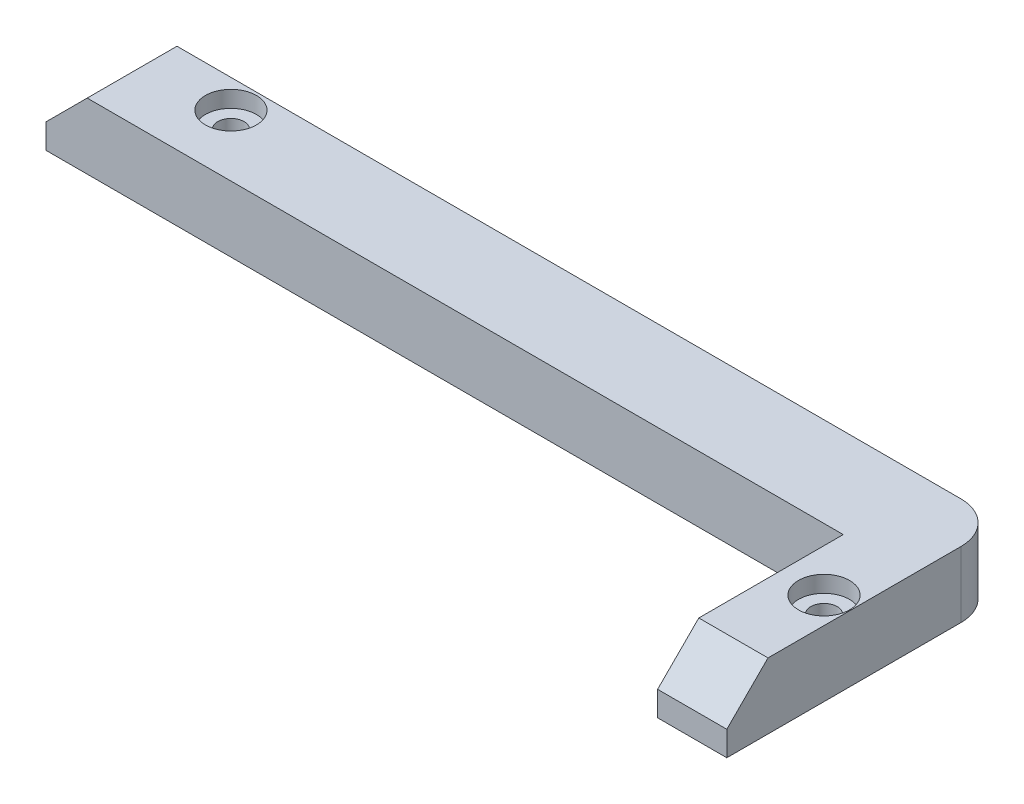
ISO-10303-21;
HEADER;
FILE_DESCRIPTION(('STEP AP214'),'2;1');
FILE_NAME('part.step','',(''),(''),'','','');
FILE_SCHEMA(('AUTOMOTIVE_DESIGN { 1 0 10303 214 1 1 1 1 }'));
ENDSEC;
DATA;
#1=APPLICATION_CONTEXT('core data for automotive mechanical design processes');
#2=APPLICATION_PROTOCOL_DEFINITION('international standard','automotive_design',2000,#1);
#3=PRODUCT_CONTEXT('',#1,'mechanical');
#4=PRODUCT('Part','Part','',(#3));
#5=PRODUCT_RELATED_PRODUCT_CATEGORY('part','',(#4));
#6=PRODUCT_DEFINITION_FORMATION('','',#4);
#7=PRODUCT_DEFINITION_CONTEXT('part definition',#1,'design');
#8=PRODUCT_DEFINITION('design','',#6,#7);
#9=PRODUCT_DEFINITION_SHAPE('','',#8);
#10=(LENGTH_UNIT() NAMED_UNIT(*) SI_UNIT(.MILLI.,.METRE.));
#11=(NAMED_UNIT(*) PLANE_ANGLE_UNIT() SI_UNIT($,.RADIAN.));
#12=(NAMED_UNIT(*) SI_UNIT($,.STERADIAN.) SOLID_ANGLE_UNIT());
#13=UNCERTAINTY_MEASURE_WITH_UNIT(LENGTH_MEASURE(1.E-05),#10,'distance_accuracy_value','');
#14=(GEOMETRIC_REPRESENTATION_CONTEXT(3) GLOBAL_UNCERTAINTY_ASSIGNED_CONTEXT((#13)) GLOBAL_UNIT_ASSIGNED_CONTEXT((#10,
#11,#12)) REPRESENTATION_CONTEXT('',''));
#15=CARTESIAN_POINT('',(0.,0.,0.));
#16=DIRECTION('',(0.,0.,1.));
#17=DIRECTION('',(1.,0.,0.));
#18=AXIS2_PLACEMENT_3D('',#15,#16,#17);
#19=CARTESIAN_POINT('',(328.95,0.,0.));
#20=DIRECTION('',(1.,0.,0.));
#21=DIRECTION('',(0.,0.,-1.));
#22=AXIS2_PLACEMENT_3D('',#19,#20,#21);
#23=PLANE('',#22);
#24=DIRECTION('',(0.,-1.,0.));
#25=VECTOR('',#24,1.);
#26=CARTESIAN_POINT('',(328.95,8.,-105.97));
#27=LINE('',#26,#25);
#28=CARTESIAN_POINT('',(328.95,8.,-105.97));
#29=VERTEX_POINT('',#28);
#30=CARTESIAN_POINT('',(328.95,0.,-105.97));
#31=VERTEX_POINT('',#30);
#32=EDGE_CURVE('E123',#29,#31,#27,.T.);
#33=ORIENTED_EDGE('',*,*,#32,.T.);
#34=DIRECTION('',(0.,0.,1.));
#35=VECTOR('',#34,1.);
#36=CARTESIAN_POINT('',(328.95,0.,0.));
#37=LINE('',#36,#35);
#38=CARTESIAN_POINT('',(328.95,0.,-83.435));
#39=VERTEX_POINT('',#38);
#40=EDGE_CURVE('E134',#31,#39,#37,.T.);
#41=ORIENTED_EDGE('',*,*,#40,.T.);
#42=DIRECTION('',(0.,-1.,0.));
#43=VECTOR('',#42,1.);
#44=CARTESIAN_POINT('',(328.95,0.,-83.435));
#45=LINE('',#44,#43);
#46=CARTESIAN_POINT('',(328.95,2.99999999999998,-83.435));
#47=VERTEX_POINT('',#46);
#48=EDGE_CURVE('E130',#47,#39,#45,.T.);
#49=ORIENTED_EDGE('',*,*,#48,.F.);
#50=DIRECTION('',(0.,0.707106781186549,-0.707106781186547));
#51=VECTOR('',#50,1.);
#52=CARTESIAN_POINT('',(328.95,8.,-88.435));
#53=LINE('',#52,#51);
#54=CARTESIAN_POINT('',(328.95,8.,-88.435));
#55=VERTEX_POINT('',#54);
#56=EDGE_CURVE('E199',#47,#55,#53,.T.);
#57=ORIENTED_EDGE('',*,*,#56,.T.);
#58=DIRECTION('',(0.,0.,-1.));
#59=VECTOR('',#58,1.);
#60=CARTESIAN_POINT('',(328.95,8.,-6.9));
#61=LINE('',#60,#59);
#62=EDGE_CURVE('E137',#55,#29,#61,.T.);
#63=ORIENTED_EDGE('',*,*,#62,.T.);
#64=EDGE_LOOP('',(#33,#41,#49,#57,#63));
#65=FACE_BOUND('',#64,.T.);
#66=ADVANCED_FACE('F49',(#65),#23,.F.);
#67=CARTESIAN_POINT('',(0.,0.,-105.97));
#68=DIRECTION('',(0.,0.,-1.));
#69=DIRECTION('',(-1.,0.,0.));
#70=AXIS2_PLACEMENT_3D('',#67,#68,#69);
#71=PLANE('',#70);
#72=DIRECTION('',(1.,0.,0.));
#73=VECTOR('',#72,1.);
#74=CARTESIAN_POINT('',(0.,0.,-105.97));
#75=LINE('',#74,#73);
#76=CARTESIAN_POINT('',(232.17,0.,-105.97));
#77=VERTEX_POINT('',#76);
#78=EDGE_CURVE('E120',#77,#31,#75,.T.);
#79=ORIENTED_EDGE('',*,*,#78,.T.);
#80=ORIENTED_EDGE('',*,*,#32,.F.);
#81=DIRECTION('',(-1.,0.,0.));
#82=VECTOR('',#81,1.);
#83=CARTESIAN_POINT('',(73.9,8.,-105.97));
#84=LINE('',#83,#82);
#85=CARTESIAN_POINT('',(237.17,8.,-105.97));
#86=VERTEX_POINT('',#85);
#87=EDGE_CURVE('E138',#29,#86,#84,.T.);
#88=ORIENTED_EDGE('',*,*,#87,.T.);
#89=DIRECTION('',(-0.707106781186544,-0.707106781186551,0.));
#90=VECTOR('',#89,1.);
#91=CARTESIAN_POINT('',(237.17,8.,-105.97));
#92=LINE('',#91,#90);
#93=CARTESIAN_POINT('',(232.17,3.,-105.97));
#94=VERTEX_POINT('',#93);
#95=EDGE_CURVE('E72',#86,#94,#92,.T.);
#96=ORIENTED_EDGE('',*,*,#95,.T.);
#97=DIRECTION('',(0.,1.,0.));
#98=VECTOR('',#97,1.);
#99=CARTESIAN_POINT('',(232.17,0.,-105.97));
#100=LINE('',#99,#98);
#101=EDGE_CURVE('E125',#77,#94,#100,.T.);
#102=ORIENTED_EDGE('',*,*,#101,.F.);
#103=EDGE_LOOP('',(#79,#80,#88,#96,#102));
#104=FACE_BOUND('',#103,.T.);
#105=ADVANCED_FACE('F122',(#104),#71,.F.);
#106=CARTESIAN_POINT('',(0.,8.,0.));
#107=DIRECTION('',(0.,-1.,0.));
#108=DIRECTION('',(0.,0.,-1.));
#109=AXIS2_PLACEMENT_3D('',#106,#107,#108);
#110=PLANE('',#109);
#111=CARTESIAN_POINT('',(247.17,8.,-113.42));
#112=DIRECTION('',(0.,1.,0.));
#113=DIRECTION('',(0.,0.,1.));
#114=AXIS2_PLACEMENT_3D('',#111,#112,#113);
#115=CIRCLE('',#114,3.09999999999999);
#116=CARTESIAN_POINT('',(247.17,8.,-110.32));
#117=VERTEX_POINT('',#116);
#118=EDGE_CURVE('E222',#117,#117,#115,.T.);
#119=ORIENTED_EDGE('',*,*,#118,.F.);
#120=EDGE_LOOP('',(#119));
#121=FACE_BOUND('',#120,.T.);
#122=CARTESIAN_POINT('',(334.15,8.,-98.435));
#123=DIRECTION('',(0.,1.,0.));
#124=DIRECTION('',(0.,0.,1.));
#125=AXIS2_PLACEMENT_3D('',#122,#123,#124);
#126=CIRCLE('',#125,3.09999999999999);
#127=CARTESIAN_POINT('',(334.15,8.,-95.335));
#128=VERTEX_POINT('',#127);
#129=EDGE_CURVE('E129',#128,#128,#126,.T.);
#130=ORIENTED_EDGE('',*,*,#129,.F.);
#131=EDGE_LOOP('',(#130));
#132=FACE_BOUND('',#131,.T.);
#133=ORIENTED_EDGE('',*,*,#62,.F.);
#134=DIRECTION('',(1.,0.,0.));
#135=VECTOR('',#134,1.);
#136=CARTESIAN_POINT('',(337.35,8.,-88.435));
#137=LINE('',#136,#135);
#138=CARTESIAN_POINT('',(337.35,8.,-88.435));
#139=VERTEX_POINT('',#138);
#140=EDGE_CURVE('E192',#55,#139,#137,.T.);
#141=ORIENTED_EDGE('',*,*,#140,.T.);
#142=DIRECTION('',(0.,0.,-1.));
#143=VECTOR('',#142,1.);
#144=CARTESIAN_POINT('',(337.35,8.,0.));
#145=LINE('',#144,#143);
#146=CARTESIAN_POINT('',(337.35,8.,-111.87));
#147=VERTEX_POINT('',#146);
#148=EDGE_CURVE('E162',#139,#147,#145,.T.);
#149=ORIENTED_EDGE('',*,*,#148,.T.);
#150=CARTESIAN_POINT('',(332.35,8.,-111.87));
#151=DIRECTION('',(0.,-1.,0.));
#152=DIRECTION('',(0.,0.,-1.));
#153=AXIS2_PLACEMENT_3D('',#150,#151,#152);
#154=CIRCLE('',#153,5.);
#155=CARTESIAN_POINT('',(332.35,8.,-116.87));
#156=VERTEX_POINT('',#155);
#157=EDGE_CURVE('E173',#147,#156,#154,.F.);
#158=ORIENTED_EDGE('',*,*,#157,.T.);
#159=DIRECTION('',(-1.,0.,0.));
#160=VECTOR('',#159,1.);
#161=CARTESIAN_POINT('',(0.,8.,-116.87));
#162=LINE('',#161,#160);
#163=CARTESIAN_POINT('',(237.17,8.,-116.87));
#164=VERTEX_POINT('',#163);
#165=EDGE_CURVE('E164',#156,#164,#162,.T.);
#166=ORIENTED_EDGE('',*,*,#165,.T.);
#167=DIRECTION('',(0.,0.,1.));
#168=VECTOR('',#167,1.);
#169=CARTESIAN_POINT('',(237.17,8.,-105.97));
#170=LINE('',#169,#168);
#171=EDGE_CURVE('E189',#164,#86,#170,.T.);
#172=ORIENTED_EDGE('',*,*,#171,.T.);
#173=ORIENTED_EDGE('',*,*,#87,.F.);
#174=EDGE_LOOP('',(#133,#141,#149,#158,#166,#172,#173));
#175=FACE_BOUND('',#174,.T.);
#176=ADVANCED_FACE('F206',(#121,#132,#175),#110,.F.);
#177=CARTESIAN_POINT('',(0.,0.,0.));
#178=DIRECTION('',(0.,-1.,0.));
#179=DIRECTION('',(0.,0.,-1.));
#180=AXIS2_PLACEMENT_3D('',#177,#178,#179);
#181=PLANE('',#180);
#182=CARTESIAN_POINT('',(247.17,0.,-113.42));
#183=DIRECTION('',(0.,1.,0.));
#184=DIRECTION('',(0.,0.,1.));
#185=AXIS2_PLACEMENT_3D('',#182,#183,#184);
#186=CIRCLE('',#185,1.59999999999999);
#187=CARTESIAN_POINT('',(247.17,0.,-111.82));
#188=VERTEX_POINT('',#187);
#189=EDGE_CURVE('E155',#188,#188,#186,.T.);
#190=ORIENTED_EDGE('',*,*,#189,.T.);
#191=EDGE_LOOP('',(#190));
#192=FACE_BOUND('',#191,.T.);
#193=ORIENTED_EDGE('',*,*,#78,.F.);
#194=DIRECTION('',(0.,0.,1.));
#195=VECTOR('',#194,1.);
#196=CARTESIAN_POINT('',(232.17,0.,-117.98568135859));
#197=LINE('',#196,#195);
#198=CARTESIAN_POINT('',(232.17,0.,-116.87));
#199=VERTEX_POINT('',#198);
#200=EDGE_CURVE('E214',#199,#77,#197,.T.);
#201=ORIENTED_EDGE('',*,*,#200,.F.);
#202=DIRECTION('',(-1.,0.,0.));
#203=VECTOR('',#202,1.);
#204=CARTESIAN_POINT('',(0.,0.,-116.87));
#205=LINE('',#204,#203);
#206=CARTESIAN_POINT('',(332.35,0.,-116.87));
#207=VERTEX_POINT('',#206);
#208=EDGE_CURVE('E165',#207,#199,#205,.T.);
#209=ORIENTED_EDGE('',*,*,#208,.F.);
#210=CARTESIAN_POINT('',(332.35,0.,-111.87));
#211=DIRECTION('',(0.,-1.,0.));
#212=DIRECTION('',(0.,0.,-1.));
#213=AXIS2_PLACEMENT_3D('',#210,#211,#212);
#214=CIRCLE('',#213,5.);
#215=CARTESIAN_POINT('',(337.35,0.,-111.87));
#216=VERTEX_POINT('',#215);
#217=EDGE_CURVE('E168',#207,#216,#214,.T.);
#218=ORIENTED_EDGE('',*,*,#217,.T.);
#219=DIRECTION('',(0.,0.,-1.));
#220=VECTOR('',#219,1.);
#221=CARTESIAN_POINT('',(337.35,0.,0.));
#222=LINE('',#221,#220);
#223=CARTESIAN_POINT('',(337.35,0.,-83.435));
#224=VERTEX_POINT('',#223);
#225=EDGE_CURVE('E161',#224,#216,#222,.T.);
#226=ORIENTED_EDGE('',*,*,#225,.F.);
#227=DIRECTION('',(1.,0.,0.));
#228=VECTOR('',#227,1.);
#229=CARTESIAN_POINT('',(232.17,0.,-83.435));
#230=LINE('',#229,#228);
#231=EDGE_CURVE('E144',#39,#224,#230,.T.);
#232=ORIENTED_EDGE('',*,*,#231,.F.);
#233=ORIENTED_EDGE('',*,*,#40,.F.);
#234=EDGE_LOOP('',(#193,#201,#209,#218,#226,#232,#233));
#235=FACE_BOUND('',#234,.T.);
#236=CARTESIAN_POINT('',(334.15,0.,-98.435));
#237=DIRECTION('',(0.,1.,0.));
#238=DIRECTION('',(0.,0.,1.));
#239=AXIS2_PLACEMENT_3D('',#236,#237,#238);
#240=CIRCLE('',#239,1.59999999999999);
#241=CARTESIAN_POINT('',(334.15,0.,-96.835));
#242=VERTEX_POINT('',#241);
#243=EDGE_CURVE('E158',#242,#242,#240,.T.);
#244=ORIENTED_EDGE('',*,*,#243,.T.);
#245=EDGE_LOOP('',(#244));
#246=FACE_BOUND('',#245,.T.);
#247=ADVANCED_FACE('F141',(#192,#235,#246),#181,.T.);
#248=CARTESIAN_POINT('',(337.35,8.,0.));
#249=DIRECTION('',(-1.,0.,0.));
#250=DIRECTION('',(0.,0.,1.));
#251=AXIS2_PLACEMENT_3D('',#248,#249,#250);
#252=PLANE('',#251);
#253=ORIENTED_EDGE('',*,*,#148,.F.);
#254=DIRECTION('',(0.,-0.707106781186549,0.707106781186547));
#255=VECTOR('',#254,1.);
#256=CARTESIAN_POINT('',(337.35,8.,-88.435));
#257=LINE('',#256,#255);
#258=CARTESIAN_POINT('',(337.35,2.99999999999998,-83.435));
#259=VERTEX_POINT('',#258);
#260=EDGE_CURVE('E195',#139,#259,#257,.T.);
#261=ORIENTED_EDGE('',*,*,#260,.T.);
#262=DIRECTION('',(0.,1.,0.));
#263=VECTOR('',#262,1.);
#264=CARTESIAN_POINT('',(337.35,8.,-83.435));
#265=LINE('',#264,#263);
#266=EDGE_CURVE('E186',#224,#259,#265,.T.);
#267=ORIENTED_EDGE('',*,*,#266,.F.);
#268=ORIENTED_EDGE('',*,*,#225,.T.);
#269=DIRECTION('',(0.,-1.,0.));
#270=VECTOR('',#269,1.);
#271=CARTESIAN_POINT('',(337.35,8.,-111.87));
#272=LINE('',#271,#270);
#273=EDGE_CURVE('E178',#216,#147,#272,.F.);
#274=ORIENTED_EDGE('',*,*,#273,.T.);
#275=EDGE_LOOP('',(#253,#261,#267,#268,#274));
#276=FACE_BOUND('',#275,.T.);
#277=ADVANCED_FACE('F211',(#276),#252,.F.);
#278=CARTESIAN_POINT('',(0.,8.,-116.87));
#279=DIRECTION('',(0.,0.,1.));
#280=DIRECTION('',(1.,0.,0.));
#281=AXIS2_PLACEMENT_3D('',#278,#279,#280);
#282=PLANE('',#281);
#283=ORIENTED_EDGE('',*,*,#208,.T.);
#284=DIRECTION('',(0.,-1.,0.));
#285=VECTOR('',#284,1.);
#286=CARTESIAN_POINT('',(232.17,8.,-116.87));
#287=LINE('',#286,#285);
#288=CARTESIAN_POINT('',(232.17,3.,-116.87));
#289=VERTEX_POINT('',#288);
#290=EDGE_CURVE('E181',#289,#199,#287,.T.);
#291=ORIENTED_EDGE('',*,*,#290,.F.);
#292=DIRECTION('',(0.707106781186544,0.707106781186551,0.));
#293=VECTOR('',#292,1.);
#294=CARTESIAN_POINT('',(237.17,8.,-116.87));
#295=LINE('',#294,#293);
#296=EDGE_CURVE('E12',#289,#164,#295,.T.);
#297=ORIENTED_EDGE('',*,*,#296,.T.);
#298=ORIENTED_EDGE('',*,*,#165,.F.);
#299=DIRECTION('',(0.,-1.,0.));
#300=VECTOR('',#299,1.);
#301=CARTESIAN_POINT('',(332.35,8.,-116.87));
#302=LINE('',#301,#300);
#303=EDGE_CURVE('E175',#156,#207,#302,.T.);
#304=ORIENTED_EDGE('',*,*,#303,.T.);
#305=EDGE_LOOP('',(#283,#291,#297,#298,#304));
#306=FACE_BOUND('',#305,.T.);
#307=ADVANCED_FACE('F258',(#306),#282,.F.);
#308=CARTESIAN_POINT('',(334.15,8.,-98.435));
#309=DIRECTION('',(0.,1.,0.));
#310=DIRECTION('',(0.,0.,1.));
#311=AXIS2_PLACEMENT_3D('',#308,#309,#310);
#312=CYLINDRICAL_SURFACE('',#311,1.59999999999999);
#313=ORIENTED_EDGE('',*,*,#243,.F.);
#314=EDGE_LOOP('',(#313));
#315=FACE_BOUND('',#314,.T.);
#316=CARTESIAN_POINT('',(334.15,6.,-98.435));
#317=DIRECTION('',(0.,1.,0.));
#318=DIRECTION('',(0.,0.,1.));
#319=AXIS2_PLACEMENT_3D('',#316,#317,#318);
#320=CIRCLE('',#319,1.59999999999999);
#321=CARTESIAN_POINT('',(334.15,6.,-96.835));
#322=VERTEX_POINT('',#321);
#323=EDGE_CURVE('E145',#322,#322,#320,.F.);
#324=ORIENTED_EDGE('',*,*,#323,.F.);
#325=EDGE_LOOP('',(#324));
#326=FACE_BOUND('',#325,.T.);
#327=ADVANCED_FACE('F255',(#315,#326),#312,.F.);
#328=CARTESIAN_POINT('',(247.17,8.,-113.42));
#329=DIRECTION('',(0.,1.,0.));
#330=DIRECTION('',(0.,0.,1.));
#331=AXIS2_PLACEMENT_3D('',#328,#329,#330);
#332=CYLINDRICAL_SURFACE('',#331,1.59999999999999);
#333=ORIENTED_EDGE('',*,*,#189,.F.);
#334=EDGE_LOOP('',(#333));
#335=FACE_BOUND('',#334,.T.);
#336=CARTESIAN_POINT('',(247.17,6.,-113.42));
#337=DIRECTION('',(0.,1.,0.));
#338=DIRECTION('',(0.,0.,1.));
#339=AXIS2_PLACEMENT_3D('',#336,#337,#338);
#340=CIRCLE('',#339,1.59999999999999);
#341=CARTESIAN_POINT('',(247.17,6.,-111.82));
#342=VERTEX_POINT('',#341);
#343=EDGE_CURVE('E149',#342,#342,#340,.F.);
#344=ORIENTED_EDGE('',*,*,#343,.F.);
#345=EDGE_LOOP('',(#344));
#346=FACE_BOUND('',#345,.T.);
#347=ADVANCED_FACE('F252',(#335,#346),#332,.F.);
#348=CARTESIAN_POINT('',(332.35,8.,-111.87));
#349=DIRECTION('',(0.,-1.,0.));
#350=DIRECTION('',(0.,0.,-1.));
#351=AXIS2_PLACEMENT_3D('',#348,#349,#350);
#352=CYLINDRICAL_SURFACE('',#351,5.);
#353=ORIENTED_EDGE('',*,*,#157,.F.);
#354=ORIENTED_EDGE('',*,*,#273,.F.);
#355=ORIENTED_EDGE('',*,*,#217,.F.);
#356=ORIENTED_EDGE('',*,*,#303,.F.);
#357=EDGE_LOOP('',(#353,#354,#355,#356));
#358=FACE_BOUND('',#357,.T.);
#359=ADVANCED_FACE('F254',(#358),#352,.T.);
#360=CARTESIAN_POINT('',(247.17,6.,-113.42));
#361=DIRECTION('',(0.,1.,0.));
#362=DIRECTION('',(0.,0.,1.));
#363=AXIS2_PLACEMENT_3D('',#360,#361,#362);
#364=PLANE('',#363);
#365=CARTESIAN_POINT('',(247.17,6.,-113.42));
#366=DIRECTION('',(0.,1.,0.));
#367=DIRECTION('',(0.,0.,1.));
#368=AXIS2_PLACEMENT_3D('',#365,#366,#367);
#369=CIRCLE('',#368,3.09999999999999);
#370=CARTESIAN_POINT('',(247.17,6.,-110.32));
#371=VERTEX_POINT('',#370);
#372=EDGE_CURVE('E183',#371,#371,#369,.T.);
#373=ORIENTED_EDGE('',*,*,#372,.T.);
#374=EDGE_LOOP('',(#373));
#375=FACE_BOUND('',#374,.T.);
#376=ORIENTED_EDGE('',*,*,#343,.T.);
#377=EDGE_LOOP('',(#376));
#378=FACE_BOUND('',#377,.T.);
#379=ADVANCED_FACE('F278',(#375,#378),#364,.T.);
#380=CARTESIAN_POINT('',(247.17,6.,-113.42));
#381=DIRECTION('',(0.,1.,0.));
#382=DIRECTION('',(0.,0.,1.));
#383=AXIS2_PLACEMENT_3D('',#380,#381,#382);
#384=CYLINDRICAL_SURFACE('',#383,3.09999999999999);
#385=ORIENTED_EDGE('',*,*,#372,.F.);
#386=EDGE_LOOP('',(#385));
#387=FACE_BOUND('',#386,.T.);
#388=ORIENTED_EDGE('',*,*,#118,.T.);
#389=EDGE_LOOP('',(#388));
#390=FACE_BOUND('',#389,.T.);
#391=ADVANCED_FACE('F271',(#387,#390),#384,.F.);
#392=CARTESIAN_POINT('',(334.15,6.,-98.435));
#393=DIRECTION('',(0.,1.,0.));
#394=DIRECTION('',(0.,0.,1.));
#395=AXIS2_PLACEMENT_3D('',#392,#393,#394);
#396=PLANE('',#395);
#397=CARTESIAN_POINT('',(334.15,6.,-98.435));
#398=DIRECTION('',(0.,1.,0.));
#399=DIRECTION('',(0.,0.,1.));
#400=AXIS2_PLACEMENT_3D('',#397,#398,#399);
#401=CIRCLE('',#400,3.09999999999999);
#402=CARTESIAN_POINT('',(334.15,6.,-95.335));
#403=VERTEX_POINT('',#402);
#404=EDGE_CURVE('E224',#403,#403,#401,.T.);
#405=ORIENTED_EDGE('',*,*,#404,.T.);
#406=EDGE_LOOP('',(#405));
#407=FACE_BOUND('',#406,.T.);
#408=ORIENTED_EDGE('',*,*,#323,.T.);
#409=EDGE_LOOP('',(#408));
#410=FACE_BOUND('',#409,.T.);
#411=ADVANCED_FACE('F269',(#407,#410),#396,.T.);
#412=CARTESIAN_POINT('',(334.15,6.,-98.435));
#413=DIRECTION('',(0.,1.,0.));
#414=DIRECTION('',(0.,0.,1.));
#415=AXIS2_PLACEMENT_3D('',#412,#413,#414);
#416=CYLINDRICAL_SURFACE('',#415,3.09999999999999);
#417=ORIENTED_EDGE('',*,*,#404,.F.);
#418=EDGE_LOOP('',(#417));
#419=FACE_BOUND('',#418,.T.);
#420=ORIENTED_EDGE('',*,*,#129,.T.);
#421=EDGE_LOOP('',(#420));
#422=FACE_BOUND('',#421,.T.);
#423=ADVANCED_FACE('F231',(#419,#422),#416,.F.);
#424=CARTESIAN_POINT('',(232.17,0.,-117.98568135859));
#425=DIRECTION('',(-1.,0.,0.));
#426=DIRECTION('',(0.,0.,1.));
#427=AXIS2_PLACEMENT_3D('',#424,#425,#426);
#428=PLANE('',#427);
#429=ORIENTED_EDGE('',*,*,#101,.T.);
#430=DIRECTION('',(0.,0.,-1.));
#431=VECTOR('',#430,1.);
#432=CARTESIAN_POINT('',(232.17,3.,-116.87));
#433=LINE('',#432,#431);
#434=EDGE_CURVE('E58',#94,#289,#433,.T.);
#435=ORIENTED_EDGE('',*,*,#434,.T.);
#436=ORIENTED_EDGE('',*,*,#290,.T.);
#437=ORIENTED_EDGE('',*,*,#200,.T.);
#438=EDGE_LOOP('',(#429,#435,#436,#437));
#439=FACE_BOUND('',#438,.T.);
#440=ADVANCED_FACE('F276',(#439),#428,.T.);
#441=CARTESIAN_POINT('',(232.17,0.,-83.435));
#442=DIRECTION('',(0.,0.,1.));
#443=DIRECTION('',(1.,0.,0.));
#444=AXIS2_PLACEMENT_3D('',#441,#442,#443);
#445=PLANE('',#444);
#446=ORIENTED_EDGE('',*,*,#266,.T.);
#447=DIRECTION('',(-1.,0.,0.));
#448=VECTOR('',#447,1.);
#449=CARTESIAN_POINT('',(328.95,2.99999999999998,-83.435));
#450=LINE('',#449,#448);
#451=EDGE_CURVE('E197',#259,#47,#450,.T.);
#452=ORIENTED_EDGE('',*,*,#451,.T.);
#453=ORIENTED_EDGE('',*,*,#48,.T.);
#454=ORIENTED_EDGE('',*,*,#231,.T.);
#455=EDGE_LOOP('',(#446,#452,#453,#454));
#456=FACE_BOUND('',#455,.T.);
#457=ADVANCED_FACE('F213',(#456),#445,.T.);
#458=CARTESIAN_POINT('',(0.,8.,-88.435));
#459=DIRECTION('',(0.,0.707106781186547,0.707106781186549));
#460=DIRECTION('',(-1.,0.,0.));
#461=AXIS2_PLACEMENT_3D('',#458,#459,#460);
#462=PLANE('',#461);
#463=ORIENTED_EDGE('',*,*,#56,.F.);
#464=ORIENTED_EDGE('',*,*,#451,.F.);
#465=ORIENTED_EDGE('',*,*,#260,.F.);
#466=ORIENTED_EDGE('',*,*,#140,.F.);
#467=EDGE_LOOP('',(#463,#464,#465,#466));
#468=FACE_BOUND('',#467,.T.);
#469=ADVANCED_FACE('F208',(#468),#462,.T.);
#470=CARTESIAN_POINT('',(237.17,8.,0.));
#471=DIRECTION('',(-0.707106781186551,0.707106781186544,0.));
#472=DIRECTION('',(0.,0.,-1.));
#473=AXIS2_PLACEMENT_3D('',#470,#471,#472);
#474=PLANE('',#473);
#475=ORIENTED_EDGE('',*,*,#296,.F.);
#476=ORIENTED_EDGE('',*,*,#434,.F.);
#477=ORIENTED_EDGE('',*,*,#95,.F.);
#478=ORIENTED_EDGE('',*,*,#171,.F.);
#479=EDGE_LOOP('',(#475,#476,#477,#478));
#480=FACE_BOUND('',#479,.T.);
#481=ADVANCED_FACE('F52',(#480),#474,.T.);
#482=CLOSED_SHELL('',(#66,#105,#176,#247,#277,#307,#327,#347,#359,#379,#391,#411,#423,#440,#457,
#469,#481));
#483=MANIFOLD_SOLID_BREP('B2',#482);
#484=ADVANCED_BREP_SHAPE_REPRESENTATION('',(#18,#483),#14);
#485=SHAPE_DEFINITION_REPRESENTATION(#9,#484);
ENDSEC;
END-ISO-10303-21;
